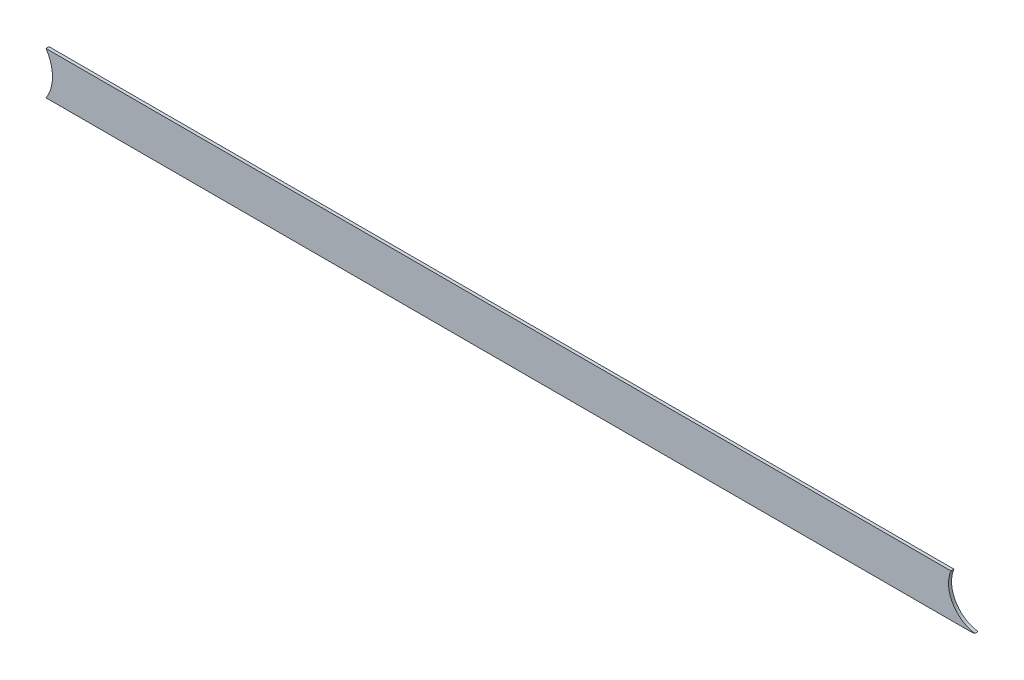
ISO-10303-21;
HEADER;
FILE_DESCRIPTION(('STEP AP214'),'2;1');
FILE_NAME('part.step','',(''),(''),'','','');
FILE_SCHEMA(('AUTOMOTIVE_DESIGN { 1 0 10303 214 1 1 1 1 }'));
ENDSEC;
DATA;
#1=APPLICATION_CONTEXT('core data for automotive mechanical design processes');
#2=APPLICATION_PROTOCOL_DEFINITION('international standard','automotive_design',2000,#1);
#3=PRODUCT_CONTEXT('',#1,'mechanical');
#4=PRODUCT('Part','Part','',(#3));
#5=PRODUCT_RELATED_PRODUCT_CATEGORY('part','',(#4));
#6=PRODUCT_DEFINITION_FORMATION('','',#4);
#7=PRODUCT_DEFINITION_CONTEXT('part definition',#1,'design');
#8=PRODUCT_DEFINITION('design','',#6,#7);
#9=PRODUCT_DEFINITION_SHAPE('','',#8);
#10=(LENGTH_UNIT() NAMED_UNIT(*) SI_UNIT(.MILLI.,.METRE.));
#11=(NAMED_UNIT(*) PLANE_ANGLE_UNIT() SI_UNIT($,.RADIAN.));
#12=(NAMED_UNIT(*) SI_UNIT($,.STERADIAN.) SOLID_ANGLE_UNIT());
#13=UNCERTAINTY_MEASURE_WITH_UNIT(LENGTH_MEASURE(1.E-05),#10,'distance_accuracy_value','');
#14=(GEOMETRIC_REPRESENTATION_CONTEXT(3) GLOBAL_UNCERTAINTY_ASSIGNED_CONTEXT((#13)) GLOBAL_UNIT_ASSIGNED_CONTEXT((#10,
#11,#12)) REPRESENTATION_CONTEXT('',''));
#15=CARTESIAN_POINT('',(0.,0.,0.));
#16=DIRECTION('',(0.,0.,1.));
#17=DIRECTION('',(1.,0.,0.));
#18=AXIS2_PLACEMENT_3D('',#15,#16,#17);
#19=CARTESIAN_POINT('',(39.7741717185819,85.5900117,0.));
#20=DIRECTION('',(0.,1.,0.));
#21=DIRECTION('',(1.,0.,0.));
#22=AXIS2_PLACEMENT_3D('',#19,#20,#21);
#23=PLANE('',#22);
#24=DIRECTION('',(1.,0.,0.));
#25=VECTOR('',#24,1.);
#26=CARTESIAN_POINT('',(39.39999994,85.5900117,0.03556));
#27=LINE('',#26,#25);
#28=CARTESIAN_POINT('',(39.7741717185819,85.5900117,0.03556));
#29=VERTEX_POINT('',#28);
#30=CARTESIAN_POINT('',(50.56785924,85.5900117,0.03556));
#31=VERTEX_POINT('',#30);
#32=EDGE_CURVE('E11',#29,#31,#27,.T.);
#33=ORIENTED_EDGE('',*,*,#32,.F.);
#34=DIRECTION('',(0.,0.,1.));
#35=VECTOR('',#34,1.);
#36=CARTESIAN_POINT('',(39.7741717185819,85.5900117,0.));
#37=LINE('',#36,#35);
#38=CARTESIAN_POINT('',(39.7741717185819,85.5900117,0.));
#39=VERTEX_POINT('',#38);
#40=EDGE_CURVE('E24',#39,#29,#37,.T.);
#41=ORIENTED_EDGE('',*,*,#40,.F.);
#42=DIRECTION('',(1.,0.,0.));
#43=VECTOR('',#42,1.);
#44=CARTESIAN_POINT('',(39.39999994,85.5900117,0.));
#45=LINE('',#44,#43);
#46=CARTESIAN_POINT('',(50.56785924,85.5900117,0.));
#47=VERTEX_POINT('',#46);
#48=EDGE_CURVE('E88',#39,#47,#45,.T.);
#49=ORIENTED_EDGE('',*,*,#48,.T.);
#50=DIRECTION('',(0.,0.,1.));
#51=VECTOR('',#50,1.);
#52=CARTESIAN_POINT('',(50.56785924,85.5900117,0.));
#53=LINE('',#52,#51);
#54=EDGE_CURVE('E37',#47,#31,#53,.T.);
#55=ORIENTED_EDGE('',*,*,#54,.T.);
#56=EDGE_LOOP('',(#33,#41,#49,#55));
#57=FACE_BOUND('',#56,.T.);
#58=ADVANCED_FACE('F17',(#57),#23,.F.);
#59=CARTESIAN_POINT('',(50.56785924,85.8400112,0.));
#60=DIRECTION('',(0.,0.,-1.));
#61=DIRECTION('',(0.,-1.,0.));
#62=AXIS2_PLACEMENT_3D('',#59,#60,#61);
#63=CYLINDRICAL_SURFACE('',#62,0.249999500000001);
#64=CARTESIAN_POINT('',(50.56785924,85.8400112,0.03556));
#65=DIRECTION('',(0.,0.,1.));
#66=DIRECTION('',(0.,-1.,0.));
#67=AXIS2_PLACEMENT_3D('',#64,#65,#66);
#68=CIRCLE('',#67,0.249999500000001);
#69=CARTESIAN_POINT('',(50.6323839051123,85.598482076306,0.03556));
#70=VERTEX_POINT('',#69);
#71=EDGE_CURVE('E111',#31,#70,#68,.T.);
#72=ORIENTED_EDGE('',*,*,#71,.F.);
#73=ORIENTED_EDGE('',*,*,#54,.F.);
#74=CARTESIAN_POINT('',(50.56785924,85.8400112,0.));
#75=DIRECTION('',(0.,0.,1.));
#76=DIRECTION('',(0.,-1.,0.));
#77=AXIS2_PLACEMENT_3D('',#74,#75,#76);
#78=CIRCLE('',#77,0.249999500000001);
#79=CARTESIAN_POINT('',(50.6323839051123,85.598482076306,0.));
#80=VERTEX_POINT('',#79);
#81=EDGE_CURVE('E108',#47,#80,#78,.T.);
#82=ORIENTED_EDGE('',*,*,#81,.T.);
#83=DIRECTION('',(0.,0.,1.));
#84=VECTOR('',#83,1.);
#85=CARTESIAN_POINT('',(50.6323839051123,85.598482076306,0.));
#86=LINE('',#85,#84);
#87=EDGE_CURVE('E106',#80,#70,#86,.T.);
#88=ORIENTED_EDGE('',*,*,#87,.T.);
#89=EDGE_LOOP('',(#72,#73,#82,#88));
#90=FACE_BOUND('',#89,.T.);
#91=ADVANCED_FACE('F118',(#90),#63,.T.);
#92=CARTESIAN_POINT('',(50.67887756,85.95102952,0.));
#93=DIRECTION('',(0.,0.,-1.));
#94=DIRECTION('',(1.,0.,0.));
#95=AXIS2_PLACEMENT_3D('',#92,#93,#94);
#96=CYLINDRICAL_SURFACE('',#95,0.3556);
#97=DIRECTION('',(0.,0.,1.));
#98=VECTOR('',#97,1.);
#99=CARTESIAN_POINT('',(50.3515618231253,86.0900107,0.));
#100=LINE('',#99,#98);
#101=CARTESIAN_POINT('',(50.3515618231253,86.0900107,0.));
#102=VERTEX_POINT('',#101);
#103=CARTESIAN_POINT('',(50.3515618231253,86.0900107,0.03556));
#104=VERTEX_POINT('',#103);
#105=EDGE_CURVE('E104',#102,#104,#100,.T.);
#106=ORIENTED_EDGE('',*,*,#105,.T.);
#107=CARTESIAN_POINT('',(50.67887756,85.95102952,0.03556));
#108=DIRECTION('',(0.,0.,1.));
#109=DIRECTION('',(1.,0.,0.));
#110=AXIS2_PLACEMENT_3D('',#107,#108,#109);
#111=CIRCLE('',#110,0.3556);
#112=EDGE_CURVE('E101',#104,#70,#111,.T.);
#113=ORIENTED_EDGE('',*,*,#112,.T.);
#114=ORIENTED_EDGE('',*,*,#87,.F.);
#115=CARTESIAN_POINT('',(50.67887756,85.95102952,0.));
#116=DIRECTION('',(0.,0.,1.));
#117=DIRECTION('',(1.,0.,0.));
#118=AXIS2_PLACEMENT_3D('',#115,#116,#117);
#119=CIRCLE('',#118,0.3556);
#120=EDGE_CURVE('E98',#102,#80,#119,.T.);
#121=ORIENTED_EDGE('',*,*,#120,.F.);
#122=EDGE_LOOP('',(#106,#113,#114,#121));
#123=FACE_BOUND('',#122,.T.);
#124=ADVANCED_FACE('F124',(#123),#96,.F.);
#125=CARTESIAN_POINT('',(50.3515618231253,86.0900107,0.));
#126=DIRECTION('',(0.,-1.,0.));
#127=DIRECTION('',(-1.,0.,0.));
#128=AXIS2_PLACEMENT_3D('',#125,#126,#127);
#129=PLANE('',#128);
#130=DIRECTION('',(-1.,0.,0.));
#131=VECTOR('',#130,1.);
#132=CARTESIAN_POINT('',(50.56785924,86.0900107,0.03556));
#133=LINE('',#132,#131);
#134=CARTESIAN_POINT('',(39.7741581417108,86.0900107,0.03556));
#135=VERTEX_POINT('',#134);
#136=EDGE_CURVE('E95',#104,#135,#133,.T.);
#137=ORIENTED_EDGE('',*,*,#136,.F.);
#138=ORIENTED_EDGE('',*,*,#105,.F.);
#139=DIRECTION('',(-1.,0.,0.));
#140=VECTOR('',#139,1.);
#141=CARTESIAN_POINT('',(50.56785924,86.0900107,0.));
#142=LINE('',#141,#140);
#143=CARTESIAN_POINT('',(39.7741581417108,86.0900107,0.));
#144=VERTEX_POINT('',#143);
#145=EDGE_CURVE('E93',#102,#144,#142,.T.);
#146=ORIENTED_EDGE('',*,*,#145,.T.);
#147=DIRECTION('',(0.,0.,1.));
#148=VECTOR('',#147,1.);
#149=CARTESIAN_POINT('',(39.7741581417108,86.0900107,0.));
#150=LINE('',#149,#148);
#151=EDGE_CURVE('E75',#144,#135,#150,.T.);
#152=ORIENTED_EDGE('',*,*,#151,.T.);
#153=EDGE_LOOP('',(#137,#138,#146,#152));
#154=FACE_BOUND('',#153,.T.);
#155=ADVANCED_FACE('F126',(#154),#129,.F.);
#156=CARTESIAN_POINT('',(39.39999994,85.84000104,0.));
#157=DIRECTION('',(0.,0.,-1.));
#158=DIRECTION('',(1.,0.,0.));
#159=AXIS2_PLACEMENT_3D('',#156,#157,#158);
#160=CYLINDRICAL_SURFACE('',#159,0.4499991);
#161=DIRECTION('',(0.,0.,1.));
#162=VECTOR('',#161,1.);
#163=CARTESIAN_POINT('',(39.84999904,85.84000104,0.));
#164=LINE('',#163,#162);
#165=CARTESIAN_POINT('',(39.84999904,85.84000104,0.));
#166=VERTEX_POINT('',#165);
#167=CARTESIAN_POINT('',(39.84999904,85.84000104,0.03556));
#168=VERTEX_POINT('',#167);
#169=EDGE_CURVE('E65',#166,#168,#164,.T.);
#170=ORIENTED_EDGE('',*,*,#169,.T.);
#171=CARTESIAN_POINT('',(39.39999994,85.84000104,0.03556));
#172=DIRECTION('',(0.,0.,1.));
#173=DIRECTION('',(1.,0.,0.));
#174=AXIS2_PLACEMENT_3D('',#171,#172,#173);
#175=CIRCLE('',#174,0.4499991);
#176=EDGE_CURVE('E76',#168,#135,#175,.T.);
#177=ORIENTED_EDGE('',*,*,#176,.T.);
#178=ORIENTED_EDGE('',*,*,#151,.F.);
#179=CARTESIAN_POINT('',(39.39999994,85.84000104,0.));
#180=DIRECTION('',(0.,0.,1.));
#181=DIRECTION('',(1.,0.,0.));
#182=AXIS2_PLACEMENT_3D('',#179,#180,#181);
#183=CIRCLE('',#182,0.4499991);
#184=EDGE_CURVE('E79',#166,#144,#183,.T.);
#185=ORIENTED_EDGE('',*,*,#184,.F.);
#186=EDGE_LOOP('',(#170,#177,#178,#185));
#187=FACE_BOUND('',#186,.T.);
#188=ADVANCED_FACE('F80',(#187),#160,.F.);
#189=CARTESIAN_POINT('',(39.39999994,85.84000104,0.));
#190=DIRECTION('',(0.,0.,-1.));
#191=DIRECTION('',(1.,0.,0.));
#192=AXIS2_PLACEMENT_3D('',#189,#190,#191);
#193=CYLINDRICAL_SURFACE('',#192,0.4499991);
#194=ORIENTED_EDGE('',*,*,#40,.T.);
#195=CARTESIAN_POINT('',(39.39999994,85.84000104,0.03556));
#196=DIRECTION('',(0.,0.,1.));
#197=DIRECTION('',(1.,0.,0.));
#198=AXIS2_PLACEMENT_3D('',#195,#196,#197);
#199=CIRCLE('',#198,0.4499991);
#200=EDGE_CURVE('E71',#29,#168,#199,.T.);
#201=ORIENTED_EDGE('',*,*,#200,.T.);
#202=ORIENTED_EDGE('',*,*,#169,.F.);
#203=EDGE_CURVE('E69',#39,#166,#183,.T.);
#204=ORIENTED_EDGE('',*,*,#203,.F.);
#205=EDGE_LOOP('',(#194,#201,#202,#204));
#206=FACE_BOUND('',#205,.T.);
#207=ADVANCED_FACE('F67',(#206),#193,.F.);
#208=CARTESIAN_POINT('',(39.39999994,85.5900117,0.));
#209=DIRECTION('',(0.,0.,-1.));
#210=DIRECTION('',(-1.,0.,0.));
#211=AXIS2_PLACEMENT_3D('',#208,#209,#210);
#212=PLANE('',#211);
#213=ORIENTED_EDGE('',*,*,#48,.F.);
#214=ORIENTED_EDGE('',*,*,#203,.T.);
#215=ORIENTED_EDGE('',*,*,#184,.T.);
#216=ORIENTED_EDGE('',*,*,#145,.F.);
#217=ORIENTED_EDGE('',*,*,#120,.T.);
#218=ORIENTED_EDGE('',*,*,#81,.F.);
#219=EDGE_LOOP('',(#213,#214,#215,#216,#217,#218));
#220=FACE_BOUND('',#219,.T.);
#221=ADVANCED_FACE('F86',(#220),#212,.T.);
#222=CARTESIAN_POINT('',(39.39999994,85.5900117,0.03556));
#223=DIRECTION('',(0.,0.,-1.));
#224=DIRECTION('',(-1.,0.,0.));
#225=AXIS2_PLACEMENT_3D('',#222,#223,#224);
#226=PLANE('',#225);
#227=ORIENTED_EDGE('',*,*,#200,.F.);
#228=ORIENTED_EDGE('',*,*,#32,.T.);
#229=ORIENTED_EDGE('',*,*,#71,.T.);
#230=ORIENTED_EDGE('',*,*,#112,.F.);
#231=ORIENTED_EDGE('',*,*,#136,.T.);
#232=ORIENTED_EDGE('',*,*,#176,.F.);
#233=EDGE_LOOP('',(#227,#228,#229,#230,#231,#232));
#234=FACE_BOUND('',#233,.T.);
#235=ADVANCED_FACE('F121',(#234),#226,.F.);
#236=CLOSED_SHELL('',(#58,#91,#124,#155,#188,#207,#221,#235));
#237=MANIFOLD_SOLID_BREP('B1',#236);
#238=ADVANCED_BREP_SHAPE_REPRESENTATION('',(#18,#237),#14);
#239=SHAPE_DEFINITION_REPRESENTATION(#9,#238);
ENDSEC;
END-ISO-10303-21;
